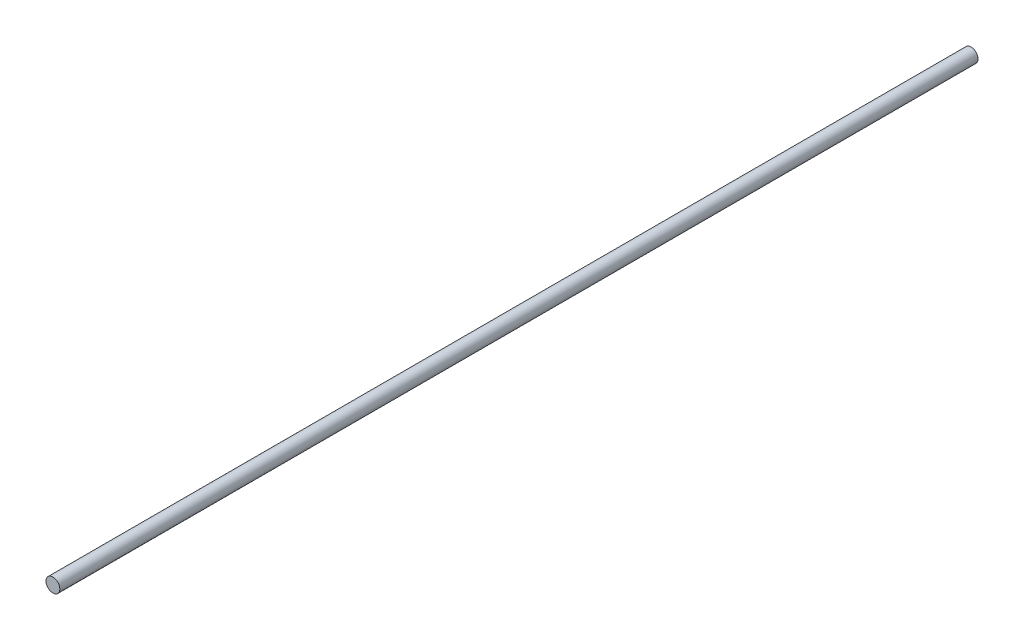
ISO-10303-21;
HEADER;
FILE_DESCRIPTION(('STEP AP214'),'2;1');
FILE_NAME('part.step','',(''),(''),'','','');
FILE_SCHEMA(('AUTOMOTIVE_DESIGN { 1 0 10303 214 1 1 1 1 }'));
ENDSEC;
DATA;
#1=APPLICATION_CONTEXT('core data for automotive mechanical design processes');
#2=APPLICATION_PROTOCOL_DEFINITION('international standard','automotive_design',2000,#1);
#3=PRODUCT_CONTEXT('',#1,'mechanical');
#4=PRODUCT('Part','Part','',(#3));
#5=PRODUCT_RELATED_PRODUCT_CATEGORY('part','',(#4));
#6=PRODUCT_DEFINITION_FORMATION('','',#4);
#7=PRODUCT_DEFINITION_CONTEXT('part definition',#1,'design');
#8=PRODUCT_DEFINITION('design','',#6,#7);
#9=PRODUCT_DEFINITION_SHAPE('','',#8);
#10=(LENGTH_UNIT() NAMED_UNIT(*) SI_UNIT(.MILLI.,.METRE.));
#11=(NAMED_UNIT(*) PLANE_ANGLE_UNIT() SI_UNIT($,.RADIAN.));
#12=(NAMED_UNIT(*) SI_UNIT($,.STERADIAN.) SOLID_ANGLE_UNIT());
#13=UNCERTAINTY_MEASURE_WITH_UNIT(LENGTH_MEASURE(1.E-05),#10,'distance_accuracy_value','');
#14=(GEOMETRIC_REPRESENTATION_CONTEXT(3) GLOBAL_UNCERTAINTY_ASSIGNED_CONTEXT((#13)) GLOBAL_UNIT_ASSIGNED_CONTEXT((#10,
#11,#12)) REPRESENTATION_CONTEXT('',''));
#15=CARTESIAN_POINT('',(0.,0.,0.));
#16=DIRECTION('',(0.,0.,1.));
#17=DIRECTION('',(1.,0.,0.));
#18=AXIS2_PLACEMENT_3D('',#15,#16,#17);
#19=CARTESIAN_POINT('',(0.,0.,631.202414599182));
#20=DIRECTION('',(0.,0.,-1.));
#21=DIRECTION('',(-1.,0.,0.));
#22=AXIS2_PLACEMENT_3D('',#19,#20,#21);
#23=CYLINDRICAL_SURFACE('',#22,4.7625);
#24=CARTESIAN_POINT('',(0.,0.,631.202414599182));
#25=DIRECTION('',(0.,0.,1.));
#26=DIRECTION('',(1.,0.,0.));
#27=AXIS2_PLACEMENT_3D('',#24,#25,#26);
#28=CIRCLE('',#27,4.7625);
#29=CARTESIAN_POINT('',(4.7625,0.,631.202414599182));
#30=VERTEX_POINT('',#29);
#31=EDGE_CURVE('E10',#30,#30,#28,.T.);
#32=ORIENTED_EDGE('',*,*,#31,.F.);
#33=EDGE_LOOP('',(#32));
#34=FACE_BOUND('',#33,.T.);
#35=CARTESIAN_POINT('',(0.,0.,0.));
#36=DIRECTION('',(0.,0.,1.));
#37=DIRECTION('',(1.,0.,0.));
#38=AXIS2_PLACEMENT_3D('',#35,#36,#37);
#39=CIRCLE('',#38,4.7625);
#40=CARTESIAN_POINT('',(4.7625,0.,0.));
#41=VERTEX_POINT('',#40);
#42=EDGE_CURVE('E46',#41,#41,#39,.T.);
#43=ORIENTED_EDGE('',*,*,#42,.T.);
#44=EDGE_LOOP('',(#43));
#45=FACE_BOUND('',#44,.T.);
#46=ADVANCED_FACE('F43',(#34,#45),#23,.T.);
#47=CARTESIAN_POINT('',(0.,0.,631.202414599182));
#48=DIRECTION('',(0.,0.,1.));
#49=DIRECTION('',(1.,0.,0.));
#50=AXIS2_PLACEMENT_3D('',#47,#48,#49);
#51=PLANE('',#50);
#52=ORIENTED_EDGE('',*,*,#31,.T.);
#53=EDGE_LOOP('',(#52));
#54=FACE_BOUND('',#53,.T.);
#55=ADVANCED_FACE('F59',(#54),#51,.T.);
#56=CARTESIAN_POINT('',(0.,0.,0.));
#57=DIRECTION('',(0.,0.,1.));
#58=DIRECTION('',(1.,0.,0.));
#59=AXIS2_PLACEMENT_3D('',#56,#57,#58);
#60=PLANE('',#59);
#61=ORIENTED_EDGE('',*,*,#42,.F.);
#62=EDGE_LOOP('',(#61));
#63=FACE_BOUND('',#62,.T.);
#64=ADVANCED_FACE('F57',(#63),#60,.F.);
#65=CLOSED_SHELL('',(#46,#55,#64));
#66=MANIFOLD_SOLID_BREP('B2',#65);
#67=ADVANCED_BREP_SHAPE_REPRESENTATION('',(#18,#66),#14);
#68=SHAPE_DEFINITION_REPRESENTATION(#9,#67);
ENDSEC;
END-ISO-10303-21;
